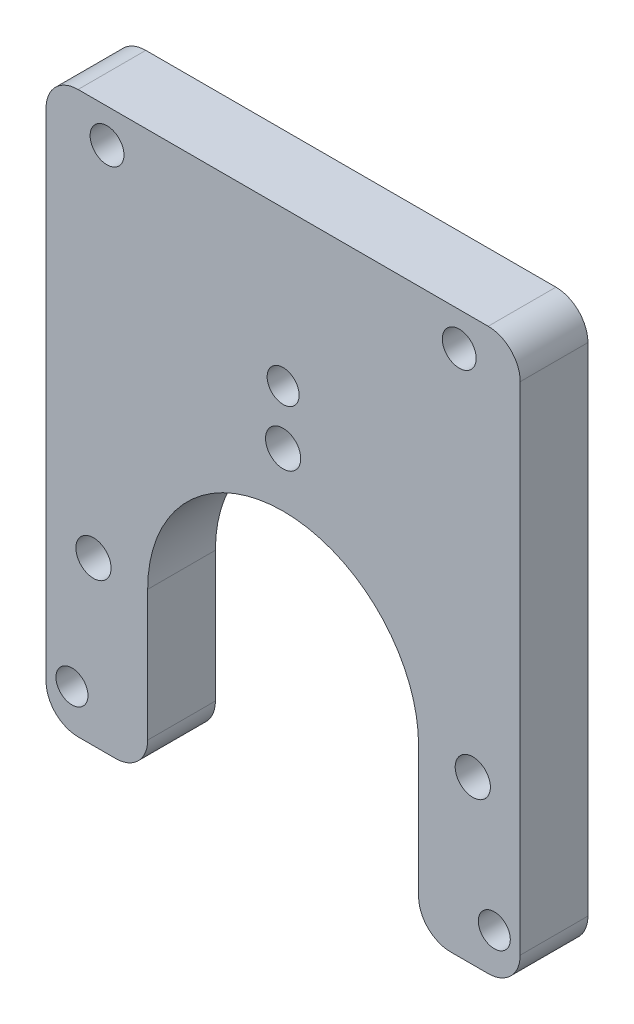
ISO-10303-21;
HEADER;
FILE_DESCRIPTION(('STEP AP214'),'2;1');
FILE_NAME('part.step','',(''),(''),'','','');
FILE_SCHEMA(('AUTOMOTIVE_DESIGN { 1 0 10303 214 1 1 1 1 }'));
ENDSEC;
DATA;
#1=APPLICATION_CONTEXT('core data for automotive mechanical design processes');
#2=APPLICATION_PROTOCOL_DEFINITION('international standard','automotive_design',2000,#1);
#3=PRODUCT_CONTEXT('',#1,'mechanical');
#4=PRODUCT('Part','Part','',(#3));
#5=PRODUCT_RELATED_PRODUCT_CATEGORY('part','',(#4));
#6=PRODUCT_DEFINITION_FORMATION('','',#4);
#7=PRODUCT_DEFINITION_CONTEXT('part definition',#1,'design');
#8=PRODUCT_DEFINITION('design','',#6,#7);
#9=PRODUCT_DEFINITION_SHAPE('','',#8);
#10=(LENGTH_UNIT() NAMED_UNIT(*) SI_UNIT(.MILLI.,.METRE.));
#11=(NAMED_UNIT(*) PLANE_ANGLE_UNIT() SI_UNIT($,.RADIAN.));
#12=(NAMED_UNIT(*) SI_UNIT($,.STERADIAN.) SOLID_ANGLE_UNIT());
#13=UNCERTAINTY_MEASURE_WITH_UNIT(LENGTH_MEASURE(1.E-05),#10,'distance_accuracy_value','');
#14=(GEOMETRIC_REPRESENTATION_CONTEXT(3) GLOBAL_UNCERTAINTY_ASSIGNED_CONTEXT((#13)) GLOBAL_UNIT_ASSIGNED_CONTEXT((#10,
#11,#12)) REPRESENTATION_CONTEXT('',''));
#15=CARTESIAN_POINT('',(0.,0.,0.));
#16=DIRECTION('',(0.,0.,1.));
#17=DIRECTION('',(1.,0.,0.));
#18=AXIS2_PLACEMENT_3D('',#15,#16,#17);
#19=CARTESIAN_POINT('',(22.225,15.24,6.35));
#20=DIRECTION('',(0.,0.,-1.));
#21=DIRECTION('',(-1.,0.,0.));
#22=AXIS2_PLACEMENT_3D('',#19,#20,#21);
#23=CYLINDRICAL_SURFACE('',#22,12.7);
#24=CARTESIAN_POINT('',(22.225,15.24,0.));
#25=DIRECTION('',(0.,0.,1.));
#26=DIRECTION('',(1.,0.,0.));
#27=AXIS2_PLACEMENT_3D('',#24,#25,#26);
#28=CIRCLE('',#27,12.7);
#29=CARTESIAN_POINT('',(34.925,15.24,0.));
#30=VERTEX_POINT('',#29);
#31=CARTESIAN_POINT('',(9.525,15.24,0.));
#32=VERTEX_POINT('',#31);
#33=EDGE_CURVE('E142',#30,#32,#28,.T.);
#34=ORIENTED_EDGE('',*,*,#33,.F.);
#35=DIRECTION('',(0.,0.,-1.));
#36=VECTOR('',#35,1.);
#37=CARTESIAN_POINT('',(34.925,15.24,6.35));
#38=LINE('',#37,#36);
#39=CARTESIAN_POINT('',(34.925,15.24,6.35));
#40=VERTEX_POINT('',#39);
#41=EDGE_CURVE('E137',#40,#30,#38,.T.);
#42=ORIENTED_EDGE('',*,*,#41,.F.);
#43=CARTESIAN_POINT('',(22.225,15.24,6.35));
#44=DIRECTION('',(0.,0.,1.));
#45=DIRECTION('',(1.,0.,0.));
#46=AXIS2_PLACEMENT_3D('',#43,#44,#45);
#47=CIRCLE('',#46,12.7);
#48=CARTESIAN_POINT('',(9.525,15.24,6.35));
#49=VERTEX_POINT('',#48);
#50=EDGE_CURVE('E140',#40,#49,#47,.T.);
#51=ORIENTED_EDGE('',*,*,#50,.T.);
#52=DIRECTION('',(0.,0.,-1.));
#53=VECTOR('',#52,1.);
#54=CARTESIAN_POINT('',(9.525,15.24,6.35));
#55=LINE('',#54,#53);
#56=EDGE_CURVE('E147',#49,#32,#55,.T.);
#57=ORIENTED_EDGE('',*,*,#56,.T.);
#58=EDGE_LOOP('',(#34,#42,#51,#57));
#59=FACE_BOUND('',#58,.T.);
#60=ADVANCED_FACE('F35',(#59),#23,.F.);
#61=CARTESIAN_POINT('',(34.925,0.,6.35));
#62=DIRECTION('',(1.,0.,0.));
#63=DIRECTION('',(0.,0.,-1.));
#64=AXIS2_PLACEMENT_3D('',#61,#62,#63);
#65=PLANE('',#64);
#66=DIRECTION('',(0.,-1.,0.));
#67=VECTOR('',#66,1.);
#68=CARTESIAN_POINT('',(34.925,0.,0.));
#69=LINE('',#68,#67);
#70=CARTESIAN_POINT('',(34.925,3.,0.));
#71=VERTEX_POINT('',#70);
#72=EDGE_CURVE('E207',#30,#71,#69,.T.);
#73=ORIENTED_EDGE('',*,*,#72,.T.);
#74=DIRECTION('',(0.,0.,-1.));
#75=VECTOR('',#74,1.);
#76=CARTESIAN_POINT('',(34.925,3.,6.35));
#77=LINE('',#76,#75);
#78=CARTESIAN_POINT('',(34.925,3.,6.35));
#79=VERTEX_POINT('',#78);
#80=EDGE_CURVE('E153',#71,#79,#77,.F.);
#81=ORIENTED_EDGE('',*,*,#80,.T.);
#82=DIRECTION('',(0.,-1.,0.));
#83=VECTOR('',#82,1.);
#84=CARTESIAN_POINT('',(34.925,0.,6.35));
#85=LINE('',#84,#83);
#86=EDGE_CURVE('E150',#40,#79,#85,.T.);
#87=ORIENTED_EDGE('',*,*,#86,.F.);
#88=ORIENTED_EDGE('',*,*,#41,.T.);
#89=EDGE_LOOP('',(#73,#81,#87,#88));
#90=FACE_BOUND('',#89,.T.);
#91=ADVANCED_FACE('F151',(#90),#65,.F.);
#92=CARTESIAN_POINT('',(0.,0.,6.35));
#93=DIRECTION('',(0.,1.,0.));
#94=DIRECTION('',(0.,0.,1.));
#95=AXIS2_PLACEMENT_3D('',#92,#93,#94);
#96=PLANE('',#95);
#97=DIRECTION('',(1.,0.,0.));
#98=VECTOR('',#97,1.);
#99=CARTESIAN_POINT('',(0.,0.,0.));
#100=LINE('',#99,#98);
#101=CARTESIAN_POINT('',(37.925,0.,0.));
#102=VERTEX_POINT('',#101);
#103=CARTESIAN_POINT('',(41.45,0.,0.));
#104=VERTEX_POINT('',#103);
#105=EDGE_CURVE('E209',#102,#104,#100,.T.);
#106=ORIENTED_EDGE('',*,*,#105,.T.);
#107=DIRECTION('',(0.,0.,-1.));
#108=VECTOR('',#107,1.);
#109=CARTESIAN_POINT('',(41.45,0.,6.35));
#110=LINE('',#109,#108);
#111=CARTESIAN_POINT('',(41.45,0.,6.35));
#112=VERTEX_POINT('',#111);
#113=EDGE_CURVE('E283',#104,#112,#110,.F.);
#114=ORIENTED_EDGE('',*,*,#113,.T.);
#115=DIRECTION('',(1.,0.,0.));
#116=VECTOR('',#115,1.);
#117=CARTESIAN_POINT('',(0.,0.,6.35));
#118=LINE('',#117,#116);
#119=CARTESIAN_POINT('',(37.925,0.,6.35));
#120=VERTEX_POINT('',#119);
#121=EDGE_CURVE('E155',#120,#112,#118,.T.);
#122=ORIENTED_EDGE('',*,*,#121,.F.);
#123=DIRECTION('',(0.,0.,-1.));
#124=VECTOR('',#123,1.);
#125=CARTESIAN_POINT('',(37.925,0.,6.35));
#126=LINE('',#125,#124);
#127=EDGE_CURVE('E280',#120,#102,#126,.T.);
#128=ORIENTED_EDGE('',*,*,#127,.T.);
#129=EDGE_LOOP('',(#106,#114,#122,#128));
#130=FACE_BOUND('',#129,.T.);
#131=ADVANCED_FACE('F311',(#130),#96,.F.);
#132=CARTESIAN_POINT('',(44.45,0.,6.35));
#133=DIRECTION('',(-1.,0.,0.));
#134=DIRECTION('',(0.,0.,1.));
#135=AXIS2_PLACEMENT_3D('',#132,#133,#134);
#136=PLANE('',#135);
#137=DIRECTION('',(0.,1.,0.));
#138=VECTOR('',#137,1.);
#139=CARTESIAN_POINT('',(44.45,0.,0.));
#140=LINE('',#139,#138);
#141=CARTESIAN_POINT('',(44.45,3.,0.));
#142=VERTEX_POINT('',#141);
#143=CARTESIAN_POINT('',(44.45,49.563,0.));
#144=VERTEX_POINT('',#143);
#145=EDGE_CURVE('E212',#142,#144,#140,.T.);
#146=ORIENTED_EDGE('',*,*,#145,.T.);
#147=DIRECTION('',(0.,0.,-1.));
#148=VECTOR('',#147,1.);
#149=CARTESIAN_POINT('',(44.45,49.563,6.35));
#150=LINE('',#149,#148);
#151=CARTESIAN_POINT('',(44.45,49.563,6.35));
#152=VERTEX_POINT('',#151);
#153=EDGE_CURVE('E278',#144,#152,#150,.F.);
#154=ORIENTED_EDGE('',*,*,#153,.T.);
#155=DIRECTION('',(0.,1.,0.));
#156=VECTOR('',#155,1.);
#157=CARTESIAN_POINT('',(44.45,0.,6.35));
#158=LINE('',#157,#156);
#159=CARTESIAN_POINT('',(44.45,3.,6.35));
#160=VERTEX_POINT('',#159);
#161=EDGE_CURVE('E170',#160,#152,#158,.T.);
#162=ORIENTED_EDGE('',*,*,#161,.F.);
#163=DIRECTION('',(0.,0.,-1.));
#164=VECTOR('',#163,1.);
#165=CARTESIAN_POINT('',(44.45,3.,6.35));
#166=LINE('',#165,#164);
#167=EDGE_CURVE('E275',#160,#142,#166,.T.);
#168=ORIENTED_EDGE('',*,*,#167,.T.);
#169=EDGE_LOOP('',(#146,#154,#162,#168));
#170=FACE_BOUND('',#169,.T.);
#171=ADVANCED_FACE('F319',(#170),#136,.F.);
#172=CARTESIAN_POINT('',(0.,52.563,6.35));
#173=DIRECTION('',(0.,1.,0.));
#174=DIRECTION('',(-1.,0.,0.));
#175=AXIS2_PLACEMENT_3D('',#172,#173,#174);
#176=PLANE('',#175);
#177=DIRECTION('',(1.,0.,0.));
#178=VECTOR('',#177,1.);
#179=CARTESIAN_POINT('',(0.,52.563,0.));
#180=LINE('',#179,#178);
#181=CARTESIAN_POINT('',(3.,52.563,0.));
#182=VERTEX_POINT('',#181);
#183=CARTESIAN_POINT('',(41.45,52.563,0.));
#184=VERTEX_POINT('',#183);
#185=EDGE_CURVE('E215',#182,#184,#180,.T.);
#186=ORIENTED_EDGE('',*,*,#185,.F.);
#187=DIRECTION('',(0.,0.,-1.));
#188=VECTOR('',#187,1.);
#189=CARTESIAN_POINT('',(3.,52.563,6.35));
#190=LINE('',#189,#188);
#191=CARTESIAN_POINT('',(3.,52.563,6.35));
#192=VERTEX_POINT('',#191);
#193=EDGE_CURVE('E262',#182,#192,#190,.F.);
#194=ORIENTED_EDGE('',*,*,#193,.T.);
#195=DIRECTION('',(1.,0.,0.));
#196=VECTOR('',#195,1.);
#197=CARTESIAN_POINT('',(0.,52.563,6.35));
#198=LINE('',#197,#196);
#199=CARTESIAN_POINT('',(41.45,52.563,6.35));
#200=VERTEX_POINT('',#199);
#201=EDGE_CURVE('E173',#192,#200,#198,.T.);
#202=ORIENTED_EDGE('',*,*,#201,.T.);
#203=DIRECTION('',(0.,0.,-1.));
#204=VECTOR('',#203,1.);
#205=CARTESIAN_POINT('',(41.45,52.563,0.));
#206=LINE('',#205,#204);
#207=EDGE_CURVE('E259',#200,#184,#206,.T.);
#208=ORIENTED_EDGE('',*,*,#207,.T.);
#209=EDGE_LOOP('',(#186,#194,#202,#208));
#210=FACE_BOUND('',#209,.T.);
#211=ADVANCED_FACE('F328',(#210),#176,.T.);
#212=CARTESIAN_POINT('',(0.,0.,6.35));
#213=DIRECTION('',(-1.,0.,0.));
#214=DIRECTION('',(0.,0.,1.));
#215=AXIS2_PLACEMENT_3D('',#212,#213,#214);
#216=PLANE('',#215);
#217=DIRECTION('',(0.,1.,0.));
#218=VECTOR('',#217,1.);
#219=CARTESIAN_POINT('',(0.,0.,6.35));
#220=LINE('',#219,#218);
#221=CARTESIAN_POINT('',(0.,3.,6.35));
#222=VERTEX_POINT('',#221);
#223=CARTESIAN_POINT('',(0.,49.563,6.35));
#224=VERTEX_POINT('',#223);
#225=EDGE_CURVE('E176',#222,#224,#220,.T.);
#226=ORIENTED_EDGE('',*,*,#225,.T.);
#227=DIRECTION('',(0.,0.,-1.));
#228=VECTOR('',#227,1.);
#229=CARTESIAN_POINT('',(0.,49.563,6.35));
#230=LINE('',#229,#228);
#231=CARTESIAN_POINT('',(0.,49.563,0.));
#232=VERTEX_POINT('',#231);
#233=EDGE_CURVE('E244',#224,#232,#230,.T.);
#234=ORIENTED_EDGE('',*,*,#233,.T.);
#235=DIRECTION('',(0.,1.,0.));
#236=VECTOR('',#235,1.);
#237=CARTESIAN_POINT('',(0.,0.,0.));
#238=LINE('',#237,#236);
#239=CARTESIAN_POINT('',(0.,3.,0.));
#240=VERTEX_POINT('',#239);
#241=EDGE_CURVE('E218',#240,#232,#238,.T.);
#242=ORIENTED_EDGE('',*,*,#241,.F.);
#243=DIRECTION('',(0.,0.,-1.));
#244=VECTOR('',#243,1.);
#245=CARTESIAN_POINT('',(0.,3.,6.35));
#246=LINE('',#245,#244);
#247=EDGE_CURVE('E146',#240,#222,#246,.F.);
#248=ORIENTED_EDGE('',*,*,#247,.T.);
#249=EDGE_LOOP('',(#226,#234,#242,#248));
#250=FACE_BOUND('',#249,.T.);
#251=ADVANCED_FACE('F335',(#250),#216,.T.);
#252=CARTESIAN_POINT('',(0.,0.,6.35));
#253=DIRECTION('',(0.,1.,0.));
#254=DIRECTION('',(0.,0.,1.));
#255=AXIS2_PLACEMENT_3D('',#252,#253,#254);
#256=PLANE('',#255);
#257=DIRECTION('',(1.,0.,0.));
#258=VECTOR('',#257,1.);
#259=CARTESIAN_POINT('',(0.,0.,0.));
#260=LINE('',#259,#258);
#261=CARTESIAN_POINT('',(3.,0.,0.));
#262=VERTEX_POINT('',#261);
#263=CARTESIAN_POINT('',(6.525,0.,0.));
#264=VERTEX_POINT('',#263);
#265=EDGE_CURVE('E221',#262,#264,#260,.T.);
#266=ORIENTED_EDGE('',*,*,#265,.T.);
#267=DIRECTION('',(0.,0.,-1.));
#268=VECTOR('',#267,1.);
#269=CARTESIAN_POINT('',(6.525,0.,6.35));
#270=LINE('',#269,#268);
#271=CARTESIAN_POINT('',(6.525,0.,6.35));
#272=VERTEX_POINT('',#271);
#273=EDGE_CURVE('E11',#264,#272,#270,.F.);
#274=ORIENTED_EDGE('',*,*,#273,.T.);
#275=DIRECTION('',(1.,0.,0.));
#276=VECTOR('',#275,1.);
#277=CARTESIAN_POINT('',(0.,0.,6.35));
#278=LINE('',#277,#276);
#279=CARTESIAN_POINT('',(3.,0.,6.35));
#280=VERTEX_POINT('',#279);
#281=EDGE_CURVE('E179',#280,#272,#278,.T.);
#282=ORIENTED_EDGE('',*,*,#281,.F.);
#283=DIRECTION('',(0.,0.,-1.));
#284=VECTOR('',#283,1.);
#285=CARTESIAN_POINT('',(3.,0.,0.));
#286=LINE('',#285,#284);
#287=EDGE_CURVE('E43',#280,#262,#286,.T.);
#288=ORIENTED_EDGE('',*,*,#287,.T.);
#289=EDGE_LOOP('',(#266,#274,#282,#288));
#290=FACE_BOUND('',#289,.T.);
#291=ADVANCED_FACE('F291',(#290),#256,.F.);
#292=CARTESIAN_POINT('',(5.715,49.388,6.35));
#293=DIRECTION('',(0.,0.,-1.));
#294=DIRECTION('',(-1.,0.,0.));
#295=AXIS2_PLACEMENT_3D('',#292,#293,#294);
#296=CYLINDRICAL_SURFACE('',#295,1.5875);
#297=CARTESIAN_POINT('',(5.715,49.388,6.35));
#298=DIRECTION('',(0.,0.,1.));
#299=DIRECTION('',(1.,0.,0.));
#300=AXIS2_PLACEMENT_3D('',#297,#298,#299);
#301=CIRCLE('',#300,1.5875);
#302=CARTESIAN_POINT('',(7.30249999999999,49.388,6.35));
#303=VERTEX_POINT('',#302);
#304=EDGE_CURVE('E191',#303,#303,#301,.T.);
#305=ORIENTED_EDGE('',*,*,#304,.T.);
#306=EDGE_LOOP('',(#305));
#307=FACE_BOUND('',#306,.T.);
#308=CARTESIAN_POINT('',(5.715,49.388,0.));
#309=DIRECTION('',(0.,0.,1.));
#310=DIRECTION('',(1.,0.,0.));
#311=AXIS2_PLACEMENT_3D('',#308,#309,#310);
#312=CIRCLE('',#311,1.5875);
#313=CARTESIAN_POINT('',(7.30249999999999,49.388,0.));
#314=VERTEX_POINT('',#313);
#315=EDGE_CURVE('E235',#314,#314,#312,.T.);
#316=ORIENTED_EDGE('',*,*,#315,.F.);
#317=EDGE_LOOP('',(#316));
#318=FACE_BOUND('',#317,.T.);
#319=ADVANCED_FACE('F474',(#307,#318),#296,.F.);
#320=CARTESIAN_POINT('',(4.445,15.24,6.35));
#321=DIRECTION('',(0.,0.,-1.));
#322=DIRECTION('',(-1.,0.,0.));
#323=AXIS2_PLACEMENT_3D('',#320,#321,#322);
#324=CYLINDRICAL_SURFACE('',#323,1.65);
#325=CARTESIAN_POINT('',(4.445,15.24,6.35));
#326=DIRECTION('',(0.,0.,1.));
#327=DIRECTION('',(1.,0.,0.));
#328=AXIS2_PLACEMENT_3D('',#325,#326,#327);
#329=CIRCLE('',#328,1.65);
#330=CARTESIAN_POINT('',(6.095,15.24,6.35));
#331=VERTEX_POINT('',#330);
#332=EDGE_CURVE('E188',#331,#331,#329,.T.);
#333=ORIENTED_EDGE('',*,*,#332,.T.);
#334=EDGE_LOOP('',(#333));
#335=FACE_BOUND('',#334,.T.);
#336=CARTESIAN_POINT('',(4.445,15.24,0.));
#337=DIRECTION('',(0.,0.,1.));
#338=DIRECTION('',(1.,0.,0.));
#339=AXIS2_PLACEMENT_3D('',#336,#337,#338);
#340=CIRCLE('',#339,1.65);
#341=CARTESIAN_POINT('',(6.095,15.24,0.));
#342=VERTEX_POINT('',#341);
#343=EDGE_CURVE('E232',#342,#342,#340,.T.);
#344=ORIENTED_EDGE('',*,*,#343,.F.);
#345=EDGE_LOOP('',(#344));
#346=FACE_BOUND('',#345,.T.);
#347=ADVANCED_FACE('F465',(#335,#346),#324,.F.);
#348=CARTESIAN_POINT('',(22.225,33.02,6.35));
#349=DIRECTION('',(0.,0.,-1.));
#350=DIRECTION('',(-1.,0.,0.));
#351=AXIS2_PLACEMENT_3D('',#348,#349,#350);
#352=CYLINDRICAL_SURFACE('',#351,1.65);
#353=CARTESIAN_POINT('',(22.225,33.02,6.35));
#354=DIRECTION('',(0.,0.,1.));
#355=DIRECTION('',(1.,0.,0.));
#356=AXIS2_PLACEMENT_3D('',#353,#354,#355);
#357=CIRCLE('',#356,1.65);
#358=CARTESIAN_POINT('',(23.875,33.02,6.35));
#359=VERTEX_POINT('',#358);
#360=EDGE_CURVE('E185',#359,#359,#357,.T.);
#361=ORIENTED_EDGE('',*,*,#360,.T.);
#362=EDGE_LOOP('',(#361));
#363=FACE_BOUND('',#362,.T.);
#364=CARTESIAN_POINT('',(22.225,33.02,0.));
#365=DIRECTION('',(0.,0.,1.));
#366=DIRECTION('',(1.,0.,0.));
#367=AXIS2_PLACEMENT_3D('',#364,#365,#366);
#368=CIRCLE('',#367,1.65);
#369=CARTESIAN_POINT('',(23.875,33.02,0.));
#370=VERTEX_POINT('',#369);
#371=EDGE_CURVE('E229',#370,#370,#368,.T.);
#372=ORIENTED_EDGE('',*,*,#371,.F.);
#373=EDGE_LOOP('',(#372));
#374=FACE_BOUND('',#373,.T.);
#375=ADVANCED_FACE('F456',(#363,#374),#352,.F.);
#376=CARTESIAN_POINT('',(40.005,15.24,6.35));
#377=DIRECTION('',(0.,0.,-1.));
#378=DIRECTION('',(-1.,0.,0.));
#379=AXIS2_PLACEMENT_3D('',#376,#377,#378);
#380=CYLINDRICAL_SURFACE('',#379,1.65);
#381=CARTESIAN_POINT('',(40.005,15.24,6.35));
#382=DIRECTION('',(0.,0.,1.));
#383=DIRECTION('',(1.,0.,0.));
#384=AXIS2_PLACEMENT_3D('',#381,#382,#383);
#385=CIRCLE('',#384,1.65);
#386=CARTESIAN_POINT('',(41.655,15.24,6.35));
#387=VERTEX_POINT('',#386);
#388=EDGE_CURVE('E182',#387,#387,#385,.T.);
#389=ORIENTED_EDGE('',*,*,#388,.T.);
#390=EDGE_LOOP('',(#389));
#391=FACE_BOUND('',#390,.T.);
#392=CARTESIAN_POINT('',(40.005,15.24,0.));
#393=DIRECTION('',(0.,0.,1.));
#394=DIRECTION('',(1.,0.,0.));
#395=AXIS2_PLACEMENT_3D('',#392,#393,#394);
#396=CIRCLE('',#395,1.65);
#397=CARTESIAN_POINT('',(41.655,15.24,0.));
#398=VERTEX_POINT('',#397);
#399=EDGE_CURVE('E226',#398,#398,#396,.T.);
#400=ORIENTED_EDGE('',*,*,#399,.F.);
#401=EDGE_LOOP('',(#400));
#402=FACE_BOUND('',#401,.T.);
#403=ADVANCED_FACE('F448',(#391,#402),#380,.F.);
#404=CARTESIAN_POINT('',(9.525,0.,6.35));
#405=DIRECTION('',(1.,0.,0.));
#406=DIRECTION('',(0.,1.,0.));
#407=AXIS2_PLACEMENT_3D('',#404,#405,#406);
#408=PLANE('',#407);
#409=DIRECTION('',(0.,-1.,0.));
#410=VECTOR('',#409,1.);
#411=CARTESIAN_POINT('',(9.525,0.,6.35));
#412=LINE('',#411,#410);
#413=CARTESIAN_POINT('',(9.525,3.,6.35));
#414=VERTEX_POINT('',#413);
#415=EDGE_CURVE('E160',#49,#414,#412,.T.);
#416=ORIENTED_EDGE('',*,*,#415,.T.);
#417=DIRECTION('',(0.,0.,-1.));
#418=VECTOR('',#417,1.);
#419=CARTESIAN_POINT('',(9.525,3.,0.));
#420=LINE('',#419,#418);
#421=CARTESIAN_POINT('',(9.525,3.,0.));
#422=VERTEX_POINT('',#421);
#423=EDGE_CURVE('E286',#414,#422,#420,.T.);
#424=ORIENTED_EDGE('',*,*,#423,.T.);
#425=DIRECTION('',(0.,-1.,0.));
#426=VECTOR('',#425,1.);
#427=CARTESIAN_POINT('',(9.525,0.,0.));
#428=LINE('',#427,#426);
#429=EDGE_CURVE('E223',#32,#422,#428,.T.);
#430=ORIENTED_EDGE('',*,*,#429,.F.);
#431=ORIENTED_EDGE('',*,*,#56,.F.);
#432=EDGE_LOOP('',(#416,#424,#430,#431));
#433=FACE_BOUND('',#432,.T.);
#434=ADVANCED_FACE('F303',(#433),#408,.T.);
#435=CARTESIAN_POINT('',(22.225,38.1,6.35));
#436=DIRECTION('',(0.,0.,-1.));
#437=DIRECTION('',(-1.,0.,0.));
#438=AXIS2_PLACEMENT_3D('',#435,#436,#437);
#439=CYLINDRICAL_SURFACE('',#438,1.5);
#440=CARTESIAN_POINT('',(22.225,38.1,6.35));
#441=DIRECTION('',(0.,0.,1.));
#442=DIRECTION('',(1.,0.,0.));
#443=AXIS2_PLACEMENT_3D('',#440,#441,#442);
#444=CIRCLE('',#443,1.5);
#445=CARTESIAN_POINT('',(23.725,38.1,6.35));
#446=VERTEX_POINT('',#445);
#447=EDGE_CURVE('E161',#446,#446,#444,.T.);
#448=ORIENTED_EDGE('',*,*,#447,.T.);
#449=EDGE_LOOP('',(#448));
#450=FACE_BOUND('',#449,.T.);
#451=CARTESIAN_POINT('',(22.225,38.1,0.));
#452=DIRECTION('',(0.,0.,1.));
#453=DIRECTION('',(1.,0.,0.));
#454=AXIS2_PLACEMENT_3D('',#451,#452,#453);
#455=CIRCLE('',#454,1.5);
#456=CARTESIAN_POINT('',(23.725,38.1,0.));
#457=VERTEX_POINT('',#456);
#458=EDGE_CURVE('E203',#457,#457,#455,.T.);
#459=ORIENTED_EDGE('',*,*,#458,.F.);
#460=EDGE_LOOP('',(#459));
#461=FACE_BOUND('',#460,.T.);
#462=ADVANCED_FACE('F349',(#450,#461),#439,.F.);
#463=CARTESIAN_POINT('',(42.0223407305123,3.81000000000003,6.35));
#464=DIRECTION('',(0.,0.,-1.));
#465=DIRECTION('',(-1.,0.,0.));
#466=AXIS2_PLACEMENT_3D('',#463,#464,#465);
#467=CYLINDRICAL_SURFACE('',#466,1.5);
#468=CARTESIAN_POINT('',(42.0223407305123,3.81000000000003,6.35));
#469=DIRECTION('',(0.,0.,1.));
#470=DIRECTION('',(1.,0.,0.));
#471=AXIS2_PLACEMENT_3D('',#468,#469,#470);
#472=CIRCLE('',#471,1.5);
#473=CARTESIAN_POINT('',(43.5223407305123,3.81000000000003,6.35));
#474=VERTEX_POINT('',#473);
#475=EDGE_CURVE('E164',#474,#474,#472,.T.);
#476=ORIENTED_EDGE('',*,*,#475,.T.);
#477=EDGE_LOOP('',(#476));
#478=FACE_BOUND('',#477,.T.);
#479=CARTESIAN_POINT('',(42.0223407305123,3.81000000000003,0.));
#480=DIRECTION('',(0.,0.,1.));
#481=DIRECTION('',(1.,0.,0.));
#482=AXIS2_PLACEMENT_3D('',#479,#480,#481);
#483=CIRCLE('',#482,1.5);
#484=CARTESIAN_POINT('',(43.5223407305123,3.81000000000003,0.));
#485=VERTEX_POINT('',#484);
#486=EDGE_CURVE('E200',#485,#485,#483,.T.);
#487=ORIENTED_EDGE('',*,*,#486,.F.);
#488=EDGE_LOOP('',(#487));
#489=FACE_BOUND('',#488,.T.);
#490=ADVANCED_FACE('F352',(#478,#489),#467,.F.);
#491=CARTESIAN_POINT('',(2.42765926948774,3.80999999999998,6.35));
#492=DIRECTION('',(0.,0.,-1.));
#493=DIRECTION('',(-1.,0.,0.));
#494=AXIS2_PLACEMENT_3D('',#491,#492,#493);
#495=CYLINDRICAL_SURFACE('',#494,1.5);
#496=CARTESIAN_POINT('',(2.42765926948774,3.80999999999998,6.35));
#497=DIRECTION('',(0.,0.,1.));
#498=DIRECTION('',(1.,0.,0.));
#499=AXIS2_PLACEMENT_3D('',#496,#497,#498);
#500=CIRCLE('',#499,1.5);
#501=CARTESIAN_POINT('',(3.92765926948774,3.80999999999998,6.35));
#502=VERTEX_POINT('',#501);
#503=EDGE_CURVE('E241',#502,#502,#500,.T.);
#504=ORIENTED_EDGE('',*,*,#503,.T.);
#505=EDGE_LOOP('',(#504));
#506=FACE_BOUND('',#505,.T.);
#507=CARTESIAN_POINT('',(2.42765926948774,3.80999999999998,0.));
#508=DIRECTION('',(0.,0.,1.));
#509=DIRECTION('',(1.,0.,0.));
#510=AXIS2_PLACEMENT_3D('',#507,#508,#509);
#511=CIRCLE('',#510,1.5);
#512=CARTESIAN_POINT('',(3.92765926948774,3.80999999999998,0.));
#513=VERTEX_POINT('',#512);
#514=EDGE_CURVE('E197',#513,#513,#511,.T.);
#515=ORIENTED_EDGE('',*,*,#514,.F.);
#516=EDGE_LOOP('',(#515));
#517=FACE_BOUND('',#516,.T.);
#518=ADVANCED_FACE('F356',(#506,#517),#495,.F.);
#519=CARTESIAN_POINT('',(38.735,49.388,6.35));
#520=DIRECTION('',(0.,0.,-1.));
#521=DIRECTION('',(-1.,0.,0.));
#522=AXIS2_PLACEMENT_3D('',#519,#520,#521);
#523=CYLINDRICAL_SURFACE('',#522,1.58749999999999);
#524=CARTESIAN_POINT('',(38.735,49.388,6.35));
#525=DIRECTION('',(0.,0.,1.));
#526=DIRECTION('',(1.,0.,0.));
#527=AXIS2_PLACEMENT_3D('',#524,#525,#526);
#528=CIRCLE('',#527,1.58749999999999);
#529=CARTESIAN_POINT('',(40.3225,49.388,6.35));
#530=VERTEX_POINT('',#529);
#531=EDGE_CURVE('E194',#530,#530,#528,.F.);
#532=ORIENTED_EDGE('',*,*,#531,.F.);
#533=EDGE_LOOP('',(#532));
#534=FACE_BOUND('',#533,.T.);
#535=CARTESIAN_POINT('',(38.735,49.388,0.));
#536=DIRECTION('',(0.,0.,1.));
#537=DIRECTION('',(1.,0.,0.));
#538=AXIS2_PLACEMENT_3D('',#535,#536,#537);
#539=CIRCLE('',#538,1.58749999999999);
#540=CARTESIAN_POINT('',(40.3225,49.388,0.));
#541=VERTEX_POINT('',#540);
#542=EDGE_CURVE('E238',#541,#541,#539,.F.);
#543=ORIENTED_EDGE('',*,*,#542,.T.);
#544=EDGE_LOOP('',(#543));
#545=FACE_BOUND('',#544,.T.);
#546=ADVANCED_FACE('F360',(#534,#545),#523,.F.);
#547=CARTESIAN_POINT('',(0.,0.,6.35));
#548=DIRECTION('',(0.,0.,1.));
#549=DIRECTION('',(1.,0.,0.));
#550=AXIS2_PLACEMENT_3D('',#547,#548,#549);
#551=PLANE('',#550);
#552=ORIENTED_EDGE('',*,*,#503,.F.);
#553=EDGE_LOOP('',(#552));
#554=FACE_BOUND('',#553,.T.);
#555=ORIENTED_EDGE('',*,*,#475,.F.);
#556=EDGE_LOOP('',(#555));
#557=FACE_BOUND('',#556,.T.);
#558=ORIENTED_EDGE('',*,*,#447,.F.);
#559=EDGE_LOOP('',(#558));
#560=FACE_BOUND('',#559,.T.);
#561=ORIENTED_EDGE('',*,*,#201,.F.);
#562=CARTESIAN_POINT('',(3.,49.563,6.35));
#563=DIRECTION('',(0.,0.,1.));
#564=DIRECTION('',(1.,0.,0.));
#565=AXIS2_PLACEMENT_3D('',#562,#563,#564);
#566=CIRCLE('',#565,3.);
#567=EDGE_CURVE('E273',#192,#224,#566,.T.);
#568=ORIENTED_EDGE('',*,*,#567,.T.);
#569=ORIENTED_EDGE('',*,*,#225,.F.);
#570=CARTESIAN_POINT('',(3.,3.,6.35));
#571=DIRECTION('',(0.,0.,1.));
#572=DIRECTION('',(1.,0.,0.));
#573=AXIS2_PLACEMENT_3D('',#570,#571,#572);
#574=CIRCLE('',#573,3.);
#575=EDGE_CURVE('E264',#222,#280,#574,.T.);
#576=ORIENTED_EDGE('',*,*,#575,.T.);
#577=ORIENTED_EDGE('',*,*,#281,.T.);
#578=CARTESIAN_POINT('',(6.525,3.,6.35));
#579=DIRECTION('',(0.,0.,1.));
#580=DIRECTION('',(1.,0.,0.));
#581=AXIS2_PLACEMENT_3D('',#578,#579,#580);
#582=CIRCLE('',#581,3.);
#583=EDGE_CURVE('E50',#272,#414,#582,.T.);
#584=ORIENTED_EDGE('',*,*,#583,.T.);
#585=ORIENTED_EDGE('',*,*,#415,.F.);
#586=ORIENTED_EDGE('',*,*,#50,.F.);
#587=ORIENTED_EDGE('',*,*,#86,.T.);
#588=CARTESIAN_POINT('',(37.925,3.,6.35));
#589=DIRECTION('',(0.,0.,1.));
#590=DIRECTION('',(1.,0.,0.));
#591=AXIS2_PLACEMENT_3D('',#588,#589,#590);
#592=CIRCLE('',#591,3.);
#593=EDGE_CURVE('E267',#79,#120,#592,.T.);
#594=ORIENTED_EDGE('',*,*,#593,.T.);
#595=ORIENTED_EDGE('',*,*,#121,.T.);
#596=CARTESIAN_POINT('',(41.45,3.,6.35));
#597=DIRECTION('',(0.,0.,1.));
#598=DIRECTION('',(1.,0.,0.));
#599=AXIS2_PLACEMENT_3D('',#596,#597,#598);
#600=CIRCLE('',#599,3.);
#601=EDGE_CURVE('E269',#112,#160,#600,.T.);
#602=ORIENTED_EDGE('',*,*,#601,.T.);
#603=ORIENTED_EDGE('',*,*,#161,.T.);
#604=CARTESIAN_POINT('',(41.45,49.563,6.35));
#605=DIRECTION('',(0.,0.,1.));
#606=DIRECTION('',(1.,0.,0.));
#607=AXIS2_PLACEMENT_3D('',#604,#605,#606);
#608=CIRCLE('',#607,3.);
#609=EDGE_CURVE('E271',#152,#200,#608,.T.);
#610=ORIENTED_EDGE('',*,*,#609,.T.);
#611=EDGE_LOOP('',(#561,#568,#569,#576,#577,#584,#585,#586,#587,#594,#595,#602,#603,#610));
#612=FACE_BOUND('',#611,.T.);
#613=ORIENTED_EDGE('',*,*,#388,.F.);
#614=EDGE_LOOP('',(#613));
#615=FACE_BOUND('',#614,.T.);
#616=ORIENTED_EDGE('',*,*,#360,.F.);
#617=EDGE_LOOP('',(#616));
#618=FACE_BOUND('',#617,.T.);
#619=ORIENTED_EDGE('',*,*,#332,.F.);
#620=EDGE_LOOP('',(#619));
#621=FACE_BOUND('',#620,.T.);
#622=ORIENTED_EDGE('',*,*,#304,.F.);
#623=EDGE_LOOP('',(#622));
#624=FACE_BOUND('',#623,.T.);
#625=ORIENTED_EDGE('',*,*,#531,.T.);
#626=EDGE_LOOP('',(#625));
#627=FACE_BOUND('',#626,.T.);
#628=ADVANCED_FACE('F158',(#554,#557,#560,#612,#615,#618,#621,#624,#627),#551,.T.);
#629=CARTESIAN_POINT('',(0.,0.,0.));
#630=DIRECTION('',(0.,0.,1.));
#631=DIRECTION('',(1.,0.,0.));
#632=AXIS2_PLACEMENT_3D('',#629,#630,#631);
#633=PLANE('',#632);
#634=ORIENTED_EDGE('',*,*,#514,.T.);
#635=EDGE_LOOP('',(#634));
#636=FACE_BOUND('',#635,.T.);
#637=ORIENTED_EDGE('',*,*,#486,.T.);
#638=EDGE_LOOP('',(#637));
#639=FACE_BOUND('',#638,.T.);
#640=ORIENTED_EDGE('',*,*,#458,.T.);
#641=EDGE_LOOP('',(#640));
#642=FACE_BOUND('',#641,.T.);
#643=ORIENTED_EDGE('',*,*,#241,.T.);
#644=CARTESIAN_POINT('',(3.,49.563,0.));
#645=DIRECTION('',(0.,0.,1.));
#646=DIRECTION('',(1.,0.,0.));
#647=AXIS2_PLACEMENT_3D('',#644,#645,#646);
#648=CIRCLE('',#647,3.);
#649=EDGE_CURVE('E257',#232,#182,#648,.F.);
#650=ORIENTED_EDGE('',*,*,#649,.T.);
#651=ORIENTED_EDGE('',*,*,#185,.T.);
#652=CARTESIAN_POINT('',(41.45,49.563,0.));
#653=DIRECTION('',(0.,0.,1.));
#654=DIRECTION('',(1.,0.,0.));
#655=AXIS2_PLACEMENT_3D('',#652,#653,#654);
#656=CIRCLE('',#655,3.);
#657=EDGE_CURVE('E255',#184,#144,#656,.F.);
#658=ORIENTED_EDGE('',*,*,#657,.T.);
#659=ORIENTED_EDGE('',*,*,#145,.F.);
#660=CARTESIAN_POINT('',(41.45,3.,0.));
#661=DIRECTION('',(0.,0.,1.));
#662=DIRECTION('',(1.,0.,0.));
#663=AXIS2_PLACEMENT_3D('',#660,#661,#662);
#664=CIRCLE('',#663,3.);
#665=EDGE_CURVE('E253',#142,#104,#664,.F.);
#666=ORIENTED_EDGE('',*,*,#665,.T.);
#667=ORIENTED_EDGE('',*,*,#105,.F.);
#668=CARTESIAN_POINT('',(37.925,3.,0.));
#669=DIRECTION('',(0.,0.,1.));
#670=DIRECTION('',(1.,0.,0.));
#671=AXIS2_PLACEMENT_3D('',#668,#669,#670);
#672=CIRCLE('',#671,3.);
#673=EDGE_CURVE('E251',#102,#71,#672,.F.);
#674=ORIENTED_EDGE('',*,*,#673,.T.);
#675=ORIENTED_EDGE('',*,*,#72,.F.);
#676=ORIENTED_EDGE('',*,*,#33,.T.);
#677=ORIENTED_EDGE('',*,*,#429,.T.);
#678=CARTESIAN_POINT('',(6.525,3.,0.));
#679=DIRECTION('',(0.,0.,1.));
#680=DIRECTION('',(1.,0.,0.));
#681=AXIS2_PLACEMENT_3D('',#678,#679,#680);
#682=CIRCLE('',#681,3.);
#683=EDGE_CURVE('E249',#422,#264,#682,.F.);
#684=ORIENTED_EDGE('',*,*,#683,.T.);
#685=ORIENTED_EDGE('',*,*,#265,.F.);
#686=CARTESIAN_POINT('',(3.,3.,0.));
#687=DIRECTION('',(0.,0.,1.));
#688=DIRECTION('',(1.,0.,0.));
#689=AXIS2_PLACEMENT_3D('',#686,#687,#688);
#690=CIRCLE('',#689,3.);
#691=EDGE_CURVE('E247',#262,#240,#690,.F.);
#692=ORIENTED_EDGE('',*,*,#691,.T.);
#693=EDGE_LOOP('',(#643,#650,#651,#658,#659,#666,#667,#674,#675,#676,#677,#684,#685,#692));
#694=FACE_BOUND('',#693,.T.);
#695=ORIENTED_EDGE('',*,*,#399,.T.);
#696=EDGE_LOOP('',(#695));
#697=FACE_BOUND('',#696,.T.);
#698=ORIENTED_EDGE('',*,*,#371,.T.);
#699=EDGE_LOOP('',(#698));
#700=FACE_BOUND('',#699,.T.);
#701=ORIENTED_EDGE('',*,*,#343,.T.);
#702=EDGE_LOOP('',(#701));
#703=FACE_BOUND('',#702,.T.);
#704=ORIENTED_EDGE('',*,*,#315,.T.);
#705=EDGE_LOOP('',(#704));
#706=FACE_BOUND('',#705,.T.);
#707=ORIENTED_EDGE('',*,*,#542,.F.);
#708=EDGE_LOOP('',(#707));
#709=FACE_BOUND('',#708,.T.);
#710=ADVANCED_FACE('F295',(#636,#639,#642,#694,#697,#700,#703,#706,#709),#633,.F.);
#711=CARTESIAN_POINT('',(3.,49.563,6.35));
#712=DIRECTION('',(0.,0.,-1.));
#713=DIRECTION('',(-1.,0.,0.));
#714=AXIS2_PLACEMENT_3D('',#711,#712,#713);
#715=CYLINDRICAL_SURFACE('',#714,3.);
#716=ORIENTED_EDGE('',*,*,#567,.F.);
#717=ORIENTED_EDGE('',*,*,#193,.F.);
#718=ORIENTED_EDGE('',*,*,#649,.F.);
#719=ORIENTED_EDGE('',*,*,#233,.F.);
#720=EDGE_LOOP('',(#716,#717,#718,#719));
#721=FACE_BOUND('',#720,.T.);
#722=ADVANCED_FACE('F331',(#721),#715,.T.);
#723=CARTESIAN_POINT('',(41.45,49.563,6.35));
#724=DIRECTION('',(0.,0.,1.));
#725=DIRECTION('',(1.,0.,0.));
#726=AXIS2_PLACEMENT_3D('',#723,#724,#725);
#727=CYLINDRICAL_SURFACE('',#726,3.);
#728=ORIENTED_EDGE('',*,*,#609,.F.);
#729=ORIENTED_EDGE('',*,*,#153,.F.);
#730=ORIENTED_EDGE('',*,*,#657,.F.);
#731=ORIENTED_EDGE('',*,*,#207,.F.);
#732=EDGE_LOOP('',(#728,#729,#730,#731));
#733=FACE_BOUND('',#732,.T.);
#734=ADVANCED_FACE('F323',(#733),#727,.T.);
#735=CARTESIAN_POINT('',(41.45,3.,6.35));
#736=DIRECTION('',(0.,0.,-1.));
#737=DIRECTION('',(-1.,0.,0.));
#738=AXIS2_PLACEMENT_3D('',#735,#736,#737);
#739=CYLINDRICAL_SURFACE('',#738,3.);
#740=ORIENTED_EDGE('',*,*,#601,.F.);
#741=ORIENTED_EDGE('',*,*,#113,.F.);
#742=ORIENTED_EDGE('',*,*,#665,.F.);
#743=ORIENTED_EDGE('',*,*,#167,.F.);
#744=EDGE_LOOP('',(#740,#741,#742,#743));
#745=FACE_BOUND('',#744,.T.);
#746=ADVANCED_FACE('F314',(#745),#739,.T.);
#747=CARTESIAN_POINT('',(37.925,3.,6.35));
#748=DIRECTION('',(0.,0.,-1.));
#749=DIRECTION('',(-1.,0.,0.));
#750=AXIS2_PLACEMENT_3D('',#747,#748,#749);
#751=CYLINDRICAL_SURFACE('',#750,3.);
#752=ORIENTED_EDGE('',*,*,#593,.F.);
#753=ORIENTED_EDGE('',*,*,#80,.F.);
#754=ORIENTED_EDGE('',*,*,#673,.F.);
#755=ORIENTED_EDGE('',*,*,#127,.F.);
#756=EDGE_LOOP('',(#752,#753,#754,#755));
#757=FACE_BOUND('',#756,.T.);
#758=ADVANCED_FACE('F306',(#757),#751,.T.);
#759=CARTESIAN_POINT('',(6.525,3.,6.35));
#760=DIRECTION('',(0.,0.,1.));
#761=DIRECTION('',(1.,0.,0.));
#762=AXIS2_PLACEMENT_3D('',#759,#760,#761);
#763=CYLINDRICAL_SURFACE('',#762,3.);
#764=ORIENTED_EDGE('',*,*,#583,.F.);
#765=ORIENTED_EDGE('',*,*,#273,.F.);
#766=ORIENTED_EDGE('',*,*,#683,.F.);
#767=ORIENTED_EDGE('',*,*,#423,.F.);
#768=EDGE_LOOP('',(#764,#765,#766,#767));
#769=FACE_BOUND('',#768,.T.);
#770=ADVANCED_FACE('F301',(#769),#763,.T.);
#771=CARTESIAN_POINT('',(3.,3.,6.35));
#772=DIRECTION('',(0.,0.,1.));
#773=DIRECTION('',(1.,0.,0.));
#774=AXIS2_PLACEMENT_3D('',#771,#772,#773);
#775=CYLINDRICAL_SURFACE('',#774,3.);
#776=ORIENTED_EDGE('',*,*,#575,.F.);
#777=ORIENTED_EDGE('',*,*,#247,.F.);
#778=ORIENTED_EDGE('',*,*,#691,.F.);
#779=ORIENTED_EDGE('',*,*,#287,.F.);
#780=EDGE_LOOP('',(#776,#777,#778,#779));
#781=FACE_BOUND('',#780,.T.);
#782=ADVANCED_FACE('F37',(#781),#775,.T.);
#783=CLOSED_SHELL('',(#60,#91,#131,#171,#211,#251,#291,#319,#347,#375,#403,#434,#462,#490,#518,
#546,#628,#710,#722,#734,#746,#758,#770,#782));
#784=MANIFOLD_SOLID_BREP('B2',#783);
#785=ADVANCED_BREP_SHAPE_REPRESENTATION('',(#18,#784),#14);
#786=SHAPE_DEFINITION_REPRESENTATION(#9,#785);
ENDSEC;
END-ISO-10303-21;
